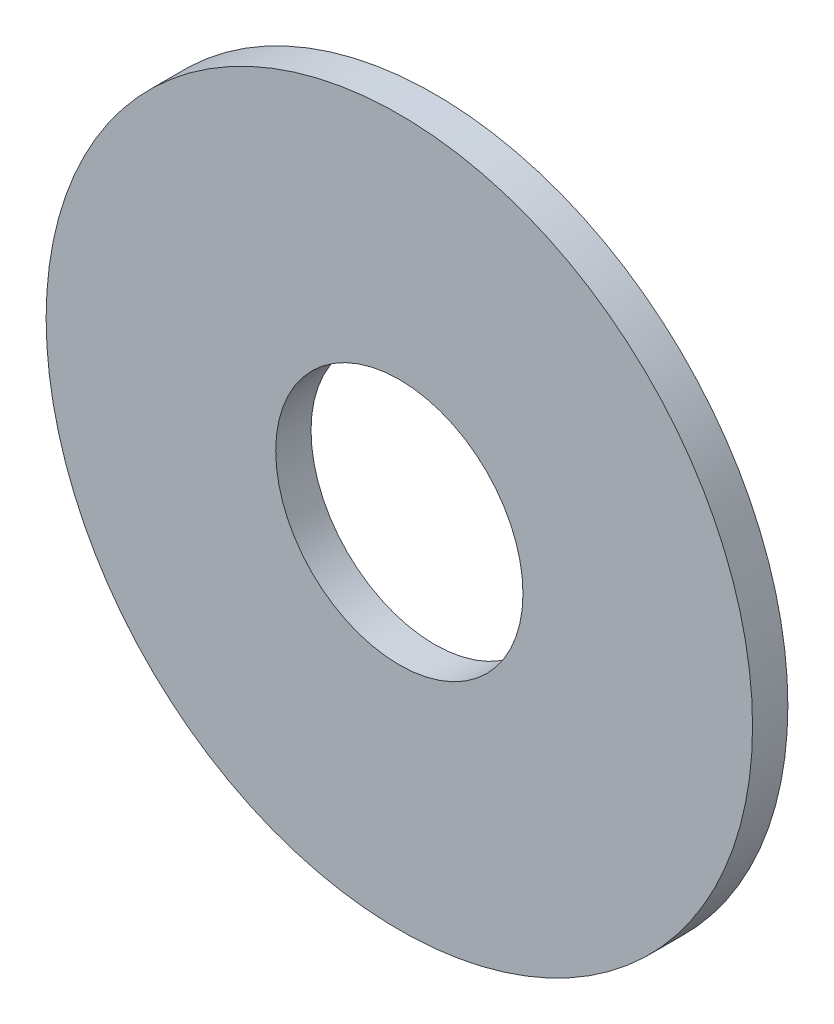
ISO-10303-21;
HEADER;
FILE_DESCRIPTION(('STEP AP214'),'2;1');
FILE_NAME('part.step','',(''),(''),'','','');
FILE_SCHEMA(('AUTOMOTIVE_DESIGN { 1 0 10303 214 1 1 1 1 }'));
ENDSEC;
DATA;
#1=APPLICATION_CONTEXT('core data for automotive mechanical design processes');
#2=APPLICATION_PROTOCOL_DEFINITION('international standard','automotive_design',2000,#1);
#3=PRODUCT_CONTEXT('',#1,'mechanical');
#4=PRODUCT('Part','Part','',(#3));
#5=PRODUCT_RELATED_PRODUCT_CATEGORY('part','',(#4));
#6=PRODUCT_DEFINITION_FORMATION('','',#4);
#7=PRODUCT_DEFINITION_CONTEXT('part definition',#1,'design');
#8=PRODUCT_DEFINITION('design','',#6,#7);
#9=PRODUCT_DEFINITION_SHAPE('','',#8);
#10=(LENGTH_UNIT() NAMED_UNIT(*) SI_UNIT(.MILLI.,.METRE.));
#11=(NAMED_UNIT(*) PLANE_ANGLE_UNIT() SI_UNIT($,.RADIAN.));
#12=(NAMED_UNIT(*) SI_UNIT($,.STERADIAN.) SOLID_ANGLE_UNIT());
#13=UNCERTAINTY_MEASURE_WITH_UNIT(LENGTH_MEASURE(1.E-05),#10,'distance_accuracy_value','');
#14=(GEOMETRIC_REPRESENTATION_CONTEXT(3) GLOBAL_UNCERTAINTY_ASSIGNED_CONTEXT((#13)) GLOBAL_UNIT_ASSIGNED_CONTEXT((#10,
#11,#12)) REPRESENTATION_CONTEXT('',''));
#15=CARTESIAN_POINT('',(0.,0.,0.));
#16=DIRECTION('',(0.,0.,1.));
#17=DIRECTION('',(1.,0.,0.));
#18=AXIS2_PLACEMENT_3D('',#15,#16,#17);
#19=CARTESIAN_POINT('',(0.,0.,2.));
#20=DIRECTION('',(0.,0.,1.));
#21=DIRECTION('',(1.,0.,0.));
#22=AXIS2_PLACEMENT_3D('',#19,#20,#21);
#23=PLANE('',#22);
#24=CARTESIAN_POINT('',(0.,0.,2.));
#25=DIRECTION('',(0.,0.,1.));
#26=DIRECTION('',(1.,0.,0.));
#27=AXIS2_PLACEMENT_3D('',#24,#25,#26);
#28=CIRCLE('',#27,20.);
#29=CARTESIAN_POINT('',(20.,0.,2.));
#30=VERTEX_POINT('',#29);
#31=EDGE_CURVE('E10',#30,#30,#28,.T.);
#32=ORIENTED_EDGE('',*,*,#31,.T.);
#33=EDGE_LOOP('',(#32));
#34=FACE_BOUND('',#33,.T.);
#35=CARTESIAN_POINT('',(0.,0.,2.));
#36=DIRECTION('',(0.,0.,1.));
#37=DIRECTION('',(1.,0.,0.));
#38=AXIS2_PLACEMENT_3D('',#35,#36,#37);
#39=CIRCLE('',#38,7.);
#40=CARTESIAN_POINT('',(7.,0.,2.));
#41=VERTEX_POINT('',#40);
#42=EDGE_CURVE('E40',#41,#41,#39,.T.);
#43=ORIENTED_EDGE('',*,*,#42,.F.);
#44=EDGE_LOOP('',(#43));
#45=FACE_BOUND('',#44,.T.);
#46=ADVANCED_FACE('F29',(#34,#45),#23,.T.);
#47=CARTESIAN_POINT('',(0.,0.,0.));
#48=DIRECTION('',(0.,0.,1.));
#49=DIRECTION('',(1.,0.,0.));
#50=AXIS2_PLACEMENT_3D('',#47,#48,#49);
#51=PLANE('',#50);
#52=CARTESIAN_POINT('',(0.,0.,0.));
#53=DIRECTION('',(0.,0.,1.));
#54=DIRECTION('',(1.,0.,0.));
#55=AXIS2_PLACEMENT_3D('',#52,#53,#54);
#56=CIRCLE('',#55,20.);
#57=CARTESIAN_POINT('',(20.,0.,0.));
#58=VERTEX_POINT('',#57);
#59=EDGE_CURVE('E33',#58,#58,#56,.T.);
#60=ORIENTED_EDGE('',*,*,#59,.F.);
#61=EDGE_LOOP('',(#60));
#62=FACE_BOUND('',#61,.T.);
#63=CARTESIAN_POINT('',(0.,0.,0.));
#64=DIRECTION('',(0.,0.,1.));
#65=DIRECTION('',(1.,0.,0.));
#66=AXIS2_PLACEMENT_3D('',#63,#64,#65);
#67=CIRCLE('',#66,7.);
#68=CARTESIAN_POINT('',(7.,0.,0.));
#69=VERTEX_POINT('',#68);
#70=EDGE_CURVE('E42',#69,#69,#67,.T.);
#71=ORIENTED_EDGE('',*,*,#70,.T.);
#72=EDGE_LOOP('',(#71));
#73=FACE_BOUND('',#72,.T.);
#74=ADVANCED_FACE('F52',(#62,#73),#51,.F.);
#75=CARTESIAN_POINT('',(0.,0.,2.));
#76=DIRECTION('',(0.,0.,-1.));
#77=DIRECTION('',(-1.,0.,0.));
#78=AXIS2_PLACEMENT_3D('',#75,#76,#77);
#79=CYLINDRICAL_SURFACE('',#78,20.);
#80=ORIENTED_EDGE('',*,*,#31,.F.);
#81=EDGE_LOOP('',(#80));
#82=FACE_BOUND('',#81,.T.);
#83=ORIENTED_EDGE('',*,*,#59,.T.);
#84=EDGE_LOOP('',(#83));
#85=FACE_BOUND('',#84,.T.);
#86=ADVANCED_FACE('F31',(#82,#85),#79,.T.);
#87=CARTESIAN_POINT('',(0.,0.,2.));
#88=DIRECTION('',(0.,0.,-1.));
#89=DIRECTION('',(-1.,0.,0.));
#90=AXIS2_PLACEMENT_3D('',#87,#88,#89);
#91=CYLINDRICAL_SURFACE('',#90,7.);
#92=ORIENTED_EDGE('',*,*,#42,.T.);
#93=EDGE_LOOP('',(#92));
#94=FACE_BOUND('',#93,.T.);
#95=ORIENTED_EDGE('',*,*,#70,.F.);
#96=EDGE_LOOP('',(#95));
#97=FACE_BOUND('',#96,.T.);
#98=ADVANCED_FACE('F48',(#94,#97),#91,.F.);
#99=CLOSED_SHELL('',(#46,#74,#86,#98));
#100=MANIFOLD_SOLID_BREP('B2',#99);
#101=ADVANCED_BREP_SHAPE_REPRESENTATION('',(#18,#100),#14);
#102=SHAPE_DEFINITION_REPRESENTATION(#9,#101);
ENDSEC;
END-ISO-10303-21;
